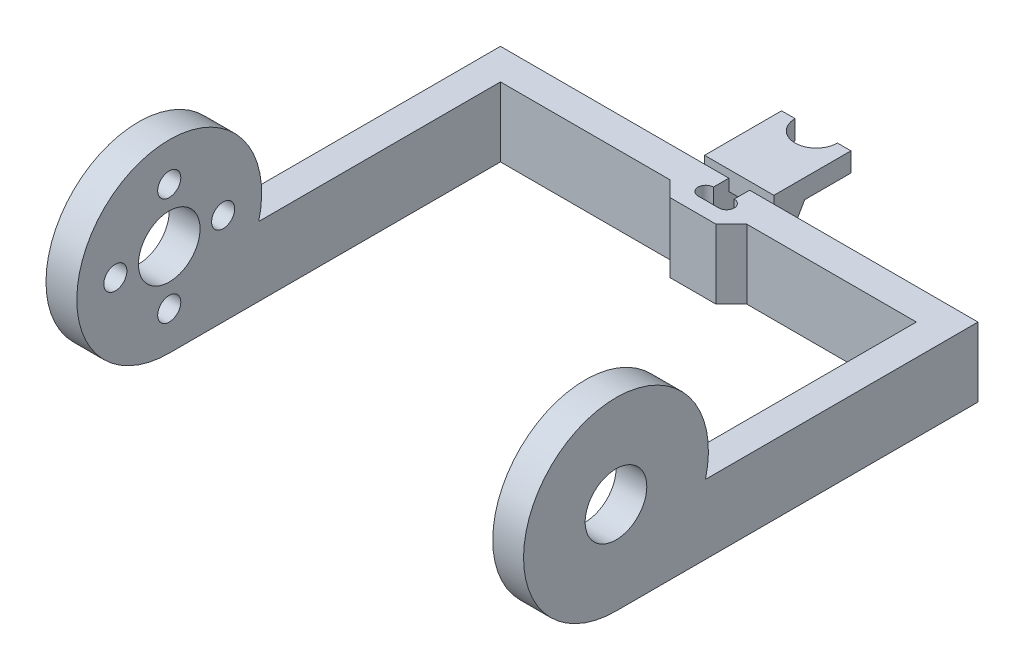
ISO-10303-21;
HEADER;
FILE_DESCRIPTION(('STEP AP214'),'2;1');
FILE_NAME('part.step','',(''),(''),'','','');
FILE_SCHEMA(('AUTOMOTIVE_DESIGN { 1 0 10303 214 1 1 1 1 }'));
ENDSEC;
DATA;
#1=APPLICATION_CONTEXT('core data for automotive mechanical design processes');
#2=APPLICATION_PROTOCOL_DEFINITION('international standard','automotive_design',2000,#1);
#3=PRODUCT_CONTEXT('',#1,'mechanical');
#4=PRODUCT('Part','Part','',(#3));
#5=PRODUCT_RELATED_PRODUCT_CATEGORY('part','',(#4));
#6=PRODUCT_DEFINITION_FORMATION('','',#4);
#7=PRODUCT_DEFINITION_CONTEXT('part definition',#1,'design');
#8=PRODUCT_DEFINITION('design','',#6,#7);
#9=PRODUCT_DEFINITION_SHAPE('','',#8);
#10=(LENGTH_UNIT() NAMED_UNIT(*) SI_UNIT(.MILLI.,.METRE.));
#11=(NAMED_UNIT(*) PLANE_ANGLE_UNIT() SI_UNIT($,.RADIAN.));
#12=(NAMED_UNIT(*) SI_UNIT($,.STERADIAN.) SOLID_ANGLE_UNIT());
#13=UNCERTAINTY_MEASURE_WITH_UNIT(LENGTH_MEASURE(1.E-05),#10,'distance_accuracy_value','');
#14=(GEOMETRIC_REPRESENTATION_CONTEXT(3) GLOBAL_UNCERTAINTY_ASSIGNED_CONTEXT((#13)) GLOBAL_UNIT_ASSIGNED_CONTEXT((#10,
#11,#12)) REPRESENTATION_CONTEXT('',''));
#15=CARTESIAN_POINT('',(0.,0.,0.));
#16=DIRECTION('',(0.,0.,1.));
#17=DIRECTION('',(1.,0.,0.));
#18=AXIS2_PLACEMENT_3D('',#15,#16,#17);
#19=CARTESIAN_POINT('',(-62.,-3.,-47.));
#20=DIRECTION('',(0.,0.,-1.));
#21=DIRECTION('',(-1.,0.,0.));
#22=AXIS2_PLACEMENT_3D('',#19,#20,#21);
#23=PLANE('',#22);
#24=DIRECTION('',(0.,1.,0.));
#25=VECTOR('',#24,1.);
#26=CARTESIAN_POINT('',(-35.5,-4.5,-47.));
#27=LINE('',#26,#25);
#28=CARTESIAN_POINT('',(-35.5,-11.4282032302756,-47.));
#29=VERTEX_POINT('',#28);
#30=CARTESIAN_POINT('',(-35.5,-3.,-47.));
#31=VERTEX_POINT('',#30);
#32=EDGE_CURVE('E310',#29,#31,#27,.T.);
#33=ORIENTED_EDGE('',*,*,#32,.F.);
#34=DIRECTION('',(1.,0.,0.));
#35=VECTOR('',#34,1.);
#36=CARTESIAN_POINT('',(-62.,-11.4282032302756,-47.));
#37=LINE('',#36,#35);
#38=CARTESIAN_POINT('',(-32.35,-11.4282032302756,-47.));
#39=VERTEX_POINT('',#38);
#40=EDGE_CURVE('E431',#29,#39,#37,.T.);
#41=ORIENTED_EDGE('',*,*,#40,.T.);
#42=DIRECTION('',(0.,1.,0.));
#43=VECTOR('',#42,1.);
#44=CARTESIAN_POINT('',(-32.35,-13.,-47.));
#45=LINE('',#44,#43);
#46=CARTESIAN_POINT('',(-32.35,-12.,-47.));
#47=VERTEX_POINT('',#46);
#48=EDGE_CURVE('E265',#47,#39,#45,.T.);
#49=ORIENTED_EDGE('',*,*,#48,.F.);
#50=DIRECTION('',(1.,0.,0.));
#51=VECTOR('',#50,1.);
#52=CARTESIAN_POINT('',(-62.,-12.,-47.));
#53=LINE('',#52,#51);
#54=CARTESIAN_POINT('',(-62.,-12.,-47.));
#55=VERTEX_POINT('',#54);
#56=EDGE_CURVE('E392',#55,#47,#53,.T.);
#57=ORIENTED_EDGE('',*,*,#56,.F.);
#58=DIRECTION('',(0.,1.,0.));
#59=VECTOR('',#58,1.);
#60=CARTESIAN_POINT('',(-62.,-3.,-47.));
#61=LINE('',#60,#59);
#62=CARTESIAN_POINT('',(-62.,-3.,-47.));
#63=VERTEX_POINT('',#62);
#64=EDGE_CURVE('E372',#55,#63,#61,.T.);
#65=ORIENTED_EDGE('',*,*,#64,.T.);
#66=DIRECTION('',(1.,0.,0.));
#67=VECTOR('',#66,1.);
#68=CARTESIAN_POINT('',(-62.,-3.,-47.));
#69=LINE('',#68,#67);
#70=EDGE_CURVE('E386',#63,#31,#69,.T.);
#71=ORIENTED_EDGE('',*,*,#70,.T.);
#72=EDGE_LOOP('',(#33,#41,#49,#57,#65,#71));
#73=FACE_BOUND('',#72,.T.);
#74=ADVANCED_FACE('F35',(#73),#23,.T.);
#75=DIRECTION('',(0.,1.,0.));
#76=VECTOR('',#75,1.);
#77=CARTESIAN_POINT('',(-29.65,-13.,-47.));
#78=LINE('',#77,#76);
#79=CARTESIAN_POINT('',(-29.65,-12.,-47.));
#80=VERTEX_POINT('',#79);
#81=CARTESIAN_POINT('',(-29.65,-11.4282032302756,-47.));
#82=VERTEX_POINT('',#81);
#83=EDGE_CURVE('E268',#80,#82,#78,.T.);
#84=ORIENTED_EDGE('',*,*,#83,.T.);
#85=DIRECTION('',(1.,0.,0.));
#86=VECTOR('',#85,1.);
#87=CARTESIAN_POINT('',(-62.,-11.4282032302756,-47.));
#88=LINE('',#87,#86);
#89=CARTESIAN_POINT('',(-26.5,-11.4282032302756,-47.));
#90=VERTEX_POINT('',#89);
#91=EDGE_CURVE('E442',#82,#90,#88,.T.);
#92=ORIENTED_EDGE('',*,*,#91,.T.);
#93=DIRECTION('',(0.,1.,0.));
#94=VECTOR('',#93,1.);
#95=CARTESIAN_POINT('',(-26.5,-4.5,-47.));
#96=LINE('',#95,#94);
#97=CARTESIAN_POINT('',(-26.5,-3.,-47.));
#98=VERTEX_POINT('',#97);
#99=EDGE_CURVE('E59',#90,#98,#96,.T.);
#100=ORIENTED_EDGE('',*,*,#99,.T.);
#101=CARTESIAN_POINT('',(0.,-3.,-47.));
#102=VERTEX_POINT('',#101);
#103=EDGE_CURVE('E395',#98,#102,#69,.T.);
#104=ORIENTED_EDGE('',*,*,#103,.T.);
#105=DIRECTION('',(0.,1.,0.));
#106=VECTOR('',#105,1.);
#107=CARTESIAN_POINT('',(0.,-3.,-47.));
#108=LINE('',#107,#106);
#109=CARTESIAN_POINT('',(0.,-12.,-47.));
#110=VERTEX_POINT('',#109);
#111=EDGE_CURVE('E366',#110,#102,#108,.T.);
#112=ORIENTED_EDGE('',*,*,#111,.F.);
#113=EDGE_CURVE('E396',#80,#110,#53,.T.);
#114=ORIENTED_EDGE('',*,*,#113,.F.);
#115=EDGE_LOOP('',(#84,#92,#100,#104,#112,#114));
#116=FACE_BOUND('',#115,.T.);
#117=ADVANCED_FACE('F468',(#116),#23,.T.);
#118=CARTESIAN_POINT('',(-62.,-3.,-47.));
#119=DIRECTION('',(0.,1.,0.));
#120=DIRECTION('',(0.,0.,1.));
#121=AXIS2_PLACEMENT_3D('',#118,#119,#120);
#122=PLANE('',#121);
#123=DIRECTION('',(1.,0.,0.));
#124=VECTOR('',#123,1.);
#125=CARTESIAN_POINT('',(-62.,-3.,-43.));
#126=LINE('',#125,#124);
#127=CARTESIAN_POINT('',(-58.,-3.,-43.));
#128=VERTEX_POINT('',#127);
#129=CARTESIAN_POINT('',(-36.,-3.,-43.));
#130=VERTEX_POINT('',#129);
#131=EDGE_CURVE('E354',#128,#130,#126,.T.);
#132=ORIENTED_EDGE('',*,*,#131,.T.);
#133=DIRECTION('',(-0.707106781186548,0.,-0.707106781186548));
#134=VECTOR('',#133,1.);
#135=CARTESIAN_POINT('',(-51.,-3.,-58.));
#136=LINE('',#135,#134);
#137=CARTESIAN_POINT('',(-34.,-3.,-41.));
#138=VERTEX_POINT('',#137);
#139=EDGE_CURVE('E429',#130,#138,#136,.F.);
#140=ORIENTED_EDGE('',*,*,#139,.T.);
#141=DIRECTION('',(1.,0.,0.));
#142=VECTOR('',#141,1.);
#143=CARTESIAN_POINT('',(-62.,-3.,-41.));
#144=LINE('',#143,#142);
#145=CARTESIAN_POINT('',(-28.,-3.,-41.));
#146=VERTEX_POINT('',#145);
#147=EDGE_CURVE('E356',#138,#146,#144,.T.);
#148=ORIENTED_EDGE('',*,*,#147,.T.);
#149=DIRECTION('',(-0.707106781186548,0.,0.707106781186548));
#150=VECTOR('',#149,1.);
#151=CARTESIAN_POINT('',(-42.,-3.,-27.));
#152=LINE('',#151,#150);
#153=CARTESIAN_POINT('',(-26.,-3.,-43.));
#154=VERTEX_POINT('',#153);
#155=EDGE_CURVE('E422',#146,#154,#152,.F.);
#156=ORIENTED_EDGE('',*,*,#155,.T.);
#157=DIRECTION('',(1.,0.,0.));
#158=VECTOR('',#157,1.);
#159=CARTESIAN_POINT('',(-62.,-3.,-43.));
#160=LINE('',#159,#158);
#161=CARTESIAN_POINT('',(-4.,-3.,-43.));
#162=VERTEX_POINT('',#161);
#163=EDGE_CURVE('E358',#154,#162,#160,.T.);
#164=ORIENTED_EDGE('',*,*,#163,.T.);
#165=DIRECTION('',(0.,0.,1.));
#166=VECTOR('',#165,1.);
#167=CARTESIAN_POINT('',(-4.,-3.,-47.));
#168=LINE('',#167,#166);
#169=CARTESIAN_POINT('',(-4.,-3.00000000000001,-11.6189500386223));
#170=VERTEX_POINT('',#169);
#171=EDGE_CURVE('E351',#162,#170,#168,.T.);
#172=ORIENTED_EDGE('',*,*,#171,.T.);
#173=DIRECTION('',(1.,0.,0.));
#174=VECTOR('',#173,1.);
#175=CARTESIAN_POINT('',(-62.,-3.00000000000001,-11.6189500386223));
#176=LINE('',#175,#174);
#177=CARTESIAN_POINT('',(0.,-3.00000000000001,-11.6189500386223));
#178=VERTEX_POINT('',#177);
#179=EDGE_CURVE('E375',#170,#178,#176,.T.);
#180=ORIENTED_EDGE('',*,*,#179,.T.);
#181=DIRECTION('',(0.,0.,1.));
#182=VECTOR('',#181,1.);
#183=CARTESIAN_POINT('',(0.,-3.,-47.));
#184=LINE('',#183,#182);
#185=EDGE_CURVE('E361',#102,#178,#184,.T.);
#186=ORIENTED_EDGE('',*,*,#185,.F.);
#187=ORIENTED_EDGE('',*,*,#103,.F.);
#188=CARTESIAN_POINT('',(-29.65,-3.,-47.));
#189=VERTEX_POINT('',#188);
#190=EDGE_CURVE('E391',#189,#98,#69,.T.);
#191=ORIENTED_EDGE('',*,*,#190,.F.);
#192=DIRECTION('',(0.,0.,-1.));
#193=VECTOR('',#192,1.);
#194=CARTESIAN_POINT('',(-29.65,-3.,-47.));
#195=LINE('',#194,#193);
#196=CARTESIAN_POINT('',(-29.65,-3.,-45.));
#197=VERTEX_POINT('',#196);
#198=EDGE_CURVE('E257',#197,#189,#195,.T.);
#199=ORIENTED_EDGE('',*,*,#198,.F.);
#200=CARTESIAN_POINT('',(-29.65,-3.,-44.));
#201=DIRECTION('',(0.,1.,0.));
#202=DIRECTION('',(0.,0.,-1.));
#203=AXIS2_PLACEMENT_3D('',#200,#201,#202);
#204=CIRCLE('',#203,1.);
#205=CARTESIAN_POINT('',(-29.65,-3.,-43.));
#206=VERTEX_POINT('',#205);
#207=EDGE_CURVE('E255',#206,#197,#204,.T.);
#208=ORIENTED_EDGE('',*,*,#207,.F.);
#209=DIRECTION('',(1.,0.,0.));
#210=VECTOR('',#209,1.);
#211=CARTESIAN_POINT('',(-32.35,-3.,-43.));
#212=LINE('',#211,#210);
#213=CARTESIAN_POINT('',(-32.35,-3.,-43.));
#214=VERTEX_POINT('',#213);
#215=EDGE_CURVE('E232',#214,#206,#212,.T.);
#216=ORIENTED_EDGE('',*,*,#215,.F.);
#217=CARTESIAN_POINT('',(-32.35,-3.,-44.));
#218=DIRECTION('',(0.,1.,0.));
#219=DIRECTION('',(0.,0.,1.));
#220=AXIS2_PLACEMENT_3D('',#217,#218,#219);
#221=CIRCLE('',#220,1.);
#222=CARTESIAN_POINT('',(-32.35,-3.,-45.));
#223=VERTEX_POINT('',#222);
#224=EDGE_CURVE('E242',#223,#214,#221,.T.);
#225=ORIENTED_EDGE('',*,*,#224,.F.);
#226=DIRECTION('',(0.,0.,1.));
#227=VECTOR('',#226,1.);
#228=CARTESIAN_POINT('',(-32.35,-3.,-45.));
#229=LINE('',#228,#227);
#230=CARTESIAN_POINT('',(-32.35,-3.,-47.));
#231=VERTEX_POINT('',#230);
#232=EDGE_CURVE('E239',#231,#223,#229,.T.);
#233=ORIENTED_EDGE('',*,*,#232,.F.);
#234=EDGE_CURVE('E390',#31,#231,#69,.T.);
#235=ORIENTED_EDGE('',*,*,#234,.F.);
#236=ORIENTED_EDGE('',*,*,#70,.F.);
#237=DIRECTION('',(0.,0.,1.));
#238=VECTOR('',#237,1.);
#239=CARTESIAN_POINT('',(-62.,-3.,-47.));
#240=LINE('',#239,#238);
#241=CARTESIAN_POINT('',(-62.,-3.00000000000001,-11.6189500386223));
#242=VERTEX_POINT('',#241);
#243=EDGE_CURVE('E362',#63,#242,#240,.T.);
#244=ORIENTED_EDGE('',*,*,#243,.T.);
#245=CARTESIAN_POINT('',(-58.,-3.00000000000001,-11.6189500386223));
#246=VERTEX_POINT('',#245);
#247=EDGE_CURVE('E401',#242,#246,#176,.T.);
#248=ORIENTED_EDGE('',*,*,#247,.T.);
#249=DIRECTION('',(0.,0.,-1.));
#250=VECTOR('',#249,1.);
#251=CARTESIAN_POINT('',(-58.,-3.,-47.));
#252=LINE('',#251,#250);
#253=EDGE_CURVE('E348',#246,#128,#252,.T.);
#254=ORIENTED_EDGE('',*,*,#253,.T.);
#255=EDGE_LOOP('',(#132,#140,#148,#156,#164,#172,#180,#186,#187,#191,#199,#208,#216,#225,#233,
#235,#236,#244,#248,#254));
#256=FACE_BOUND('',#255,.T.);
#257=ADVANCED_FACE('F252',(#256),#122,.T.);
#258=CARTESIAN_POINT('',(-62.,-12.,-47.));
#259=DIRECTION('',(0.,-1.,0.));
#260=DIRECTION('',(0.,0.,-1.));
#261=AXIS2_PLACEMENT_3D('',#258,#259,#260);
#262=PLANE('',#261);
#263=DIRECTION('',(-1.,0.,0.));
#264=VECTOR('',#263,1.);
#265=CARTESIAN_POINT('',(-36.,-12.,-41.));
#266=LINE('',#265,#264);
#267=CARTESIAN_POINT('',(-28.,-12.,-41.));
#268=VERTEX_POINT('',#267);
#269=CARTESIAN_POINT('',(-34.,-12.,-41.));
#270=VERTEX_POINT('',#269);
#271=EDGE_CURVE('E329',#268,#270,#266,.T.);
#272=ORIENTED_EDGE('',*,*,#271,.T.);
#273=DIRECTION('',(0.707106781186548,0.,0.707106781186548));
#274=VECTOR('',#273,1.);
#275=CARTESIAN_POINT('',(-51.,-12.,-58.));
#276=LINE('',#275,#274);
#277=CARTESIAN_POINT('',(-36.,-12.,-43.));
#278=VERTEX_POINT('',#277);
#279=EDGE_CURVE('E427',#270,#278,#276,.F.);
#280=ORIENTED_EDGE('',*,*,#279,.T.);
#281=DIRECTION('',(-1.,0.,0.));
#282=VECTOR('',#281,1.);
#283=CARTESIAN_POINT('',(-58.,-12.,-43.));
#284=LINE('',#283,#282);
#285=CARTESIAN_POINT('',(-58.,-12.,-43.));
#286=VERTEX_POINT('',#285);
#287=EDGE_CURVE('E332',#278,#286,#284,.T.);
#288=ORIENTED_EDGE('',*,*,#287,.T.);
#289=DIRECTION('',(0.,0.,1.));
#290=VECTOR('',#289,1.);
#291=CARTESIAN_POINT('',(-58.,-12.,12.));
#292=LINE('',#291,#290);
#293=CARTESIAN_POINT('',(-58.,-12.,0.));
#294=VERTEX_POINT('',#293);
#295=EDGE_CURVE('E335',#286,#294,#292,.T.);
#296=ORIENTED_EDGE('',*,*,#295,.T.);
#297=DIRECTION('',(1.,0.,0.));
#298=VECTOR('',#297,1.);
#299=CARTESIAN_POINT('',(-62.,-12.,0.));
#300=LINE('',#299,#298);
#301=CARTESIAN_POINT('',(-62.,-12.,0.));
#302=VERTEX_POINT('',#301);
#303=EDGE_CURVE('E397',#302,#294,#300,.T.);
#304=ORIENTED_EDGE('',*,*,#303,.F.);
#305=DIRECTION('',(0.,0.,-1.));
#306=VECTOR('',#305,1.);
#307=CARTESIAN_POINT('',(-62.,-12.,-47.));
#308=LINE('',#307,#306);
#309=EDGE_CURVE('E369',#302,#55,#308,.T.);
#310=ORIENTED_EDGE('',*,*,#309,.T.);
#311=ORIENTED_EDGE('',*,*,#56,.T.);
#312=DIRECTION('',(0.,0.,-1.));
#313=VECTOR('',#312,1.);
#314=CARTESIAN_POINT('',(-32.35,-12.,-46.9999999999999));
#315=LINE('',#314,#313);
#316=CARTESIAN_POINT('',(-32.35,-12.,-45.));
#317=VERTEX_POINT('',#316);
#318=EDGE_CURVE('E415',#317,#47,#315,.T.);
#319=ORIENTED_EDGE('',*,*,#318,.F.);
#320=CARTESIAN_POINT('',(-32.35,-12.,-44.));
#321=DIRECTION('',(0.,-1.,0.));
#322=DIRECTION('',(0.,0.,-1.));
#323=AXIS2_PLACEMENT_3D('',#320,#321,#322);
#324=CIRCLE('',#323,1.);
#325=CARTESIAN_POINT('',(-32.35,-12.,-43.));
#326=VERTEX_POINT('',#325);
#327=EDGE_CURVE('E413',#326,#317,#324,.T.);
#328=ORIENTED_EDGE('',*,*,#327,.F.);
#329=DIRECTION('',(-1.,0.,0.));
#330=VECTOR('',#329,1.);
#331=CARTESIAN_POINT('',(-62.,-12.,-43.));
#332=LINE('',#331,#330);
#333=CARTESIAN_POINT('',(-29.65,-12.,-43.));
#334=VERTEX_POINT('',#333);
#335=EDGE_CURVE('E235',#334,#326,#332,.T.);
#336=ORIENTED_EDGE('',*,*,#335,.F.);
#337=CARTESIAN_POINT('',(-29.65,-12.,-44.));
#338=DIRECTION('',(0.,-1.,0.));
#339=DIRECTION('',(0.,0.,-1.));
#340=AXIS2_PLACEMENT_3D('',#337,#338,#339);
#341=CIRCLE('',#340,1.);
#342=CARTESIAN_POINT('',(-29.65,-12.,-45.));
#343=VERTEX_POINT('',#342);
#344=EDGE_CURVE('E409',#343,#334,#341,.T.);
#345=ORIENTED_EDGE('',*,*,#344,.F.);
#346=DIRECTION('',(0.,0.,1.));
#347=VECTOR('',#346,1.);
#348=CARTESIAN_POINT('',(-29.65,-12.,-47.));
#349=LINE('',#348,#347);
#350=EDGE_CURVE('E411',#80,#343,#349,.T.);
#351=ORIENTED_EDGE('',*,*,#350,.F.);
#352=ORIENTED_EDGE('',*,*,#113,.T.);
#353=DIRECTION('',(0.,0.,-1.));
#354=VECTOR('',#353,1.);
#355=CARTESIAN_POINT('',(0.,-12.,-47.));
#356=LINE('',#355,#354);
#357=CARTESIAN_POINT('',(0.,-12.,0.));
#358=VERTEX_POINT('',#357);
#359=EDGE_CURVE('E381',#358,#110,#356,.T.);
#360=ORIENTED_EDGE('',*,*,#359,.F.);
#361=CARTESIAN_POINT('',(-4.,-12.,0.));
#362=VERTEX_POINT('',#361);
#363=EDGE_CURVE('E400',#362,#358,#300,.T.);
#364=ORIENTED_EDGE('',*,*,#363,.F.);
#365=DIRECTION('',(0.,0.,-1.));
#366=VECTOR('',#365,1.);
#367=CARTESIAN_POINT('',(-4.,-12.,-43.));
#368=LINE('',#367,#366);
#369=CARTESIAN_POINT('',(-4.,-12.,-43.));
#370=VERTEX_POINT('',#369);
#371=EDGE_CURVE('E313',#362,#370,#368,.T.);
#372=ORIENTED_EDGE('',*,*,#371,.T.);
#373=DIRECTION('',(-1.,0.,0.));
#374=VECTOR('',#373,1.);
#375=CARTESIAN_POINT('',(-26.,-12.,-43.));
#376=LINE('',#375,#374);
#377=CARTESIAN_POINT('',(-26.,-12.,-43.));
#378=VERTEX_POINT('',#377);
#379=EDGE_CURVE('E326',#370,#378,#376,.T.);
#380=ORIENTED_EDGE('',*,*,#379,.T.);
#381=DIRECTION('',(0.707106781186548,0.,-0.707106781186548));
#382=VECTOR('',#381,1.);
#383=CARTESIAN_POINT('',(-42.,-12.,-27.));
#384=LINE('',#383,#382);
#385=EDGE_CURVE('E417',#378,#268,#384,.F.);
#386=ORIENTED_EDGE('',*,*,#385,.T.);
#387=EDGE_LOOP('',(#272,#280,#288,#296,#304,#310,#311,#319,#328,#336,#345,#351,#352,#360,#364,
#372,#380,#386));
#388=FACE_BOUND('',#387,.T.);
#389=ADVANCED_FACE('F472',(#388),#262,.T.);
#390=CARTESIAN_POINT('',(-62.,0.,0.));
#391=DIRECTION('',(1.,0.,0.));
#392=DIRECTION('',(0.,0.,-1.));
#393=AXIS2_PLACEMENT_3D('',#390,#391,#392);
#394=CYLINDRICAL_SURFACE('',#393,12.);
#395=ORIENTED_EDGE('',*,*,#179,.F.);
#396=CARTESIAN_POINT('',(-4.,0.,0.));
#397=DIRECTION('',(-1.,0.,0.));
#398=DIRECTION('',(0.,0.,1.));
#399=AXIS2_PLACEMENT_3D('',#396,#397,#398);
#400=CIRCLE('',#399,12.);
#401=EDGE_CURVE('E406',#170,#362,#400,.F.);
#402=ORIENTED_EDGE('',*,*,#401,.T.);
#403=ORIENTED_EDGE('',*,*,#363,.T.);
#404=CARTESIAN_POINT('',(0.,0.,0.));
#405=DIRECTION('',(1.,0.,0.));
#406=DIRECTION('',(0.,0.,-1.));
#407=AXIS2_PLACEMENT_3D('',#404,#405,#406);
#408=CIRCLE('',#407,12.);
#409=EDGE_CURVE('E378',#178,#358,#408,.T.);
#410=ORIENTED_EDGE('',*,*,#409,.F.);
#411=EDGE_LOOP('',(#395,#402,#403,#410));
#412=FACE_BOUND('',#411,.T.);
#413=ADVANCED_FACE('F481',(#412),#394,.T.);
#414=ORIENTED_EDGE('',*,*,#303,.T.);
#415=CARTESIAN_POINT('',(-58.,0.,0.));
#416=DIRECTION('',(1.,0.,0.));
#417=DIRECTION('',(0.,0.,-1.));
#418=AXIS2_PLACEMENT_3D('',#415,#416,#417);
#419=CIRCLE('',#418,12.);
#420=EDGE_CURVE('E389',#294,#246,#419,.F.);
#421=ORIENTED_EDGE('',*,*,#420,.T.);
#422=ORIENTED_EDGE('',*,*,#247,.F.);
#423=CARTESIAN_POINT('',(-62.,0.,0.));
#424=DIRECTION('',(1.,0.,0.));
#425=DIRECTION('',(0.,0.,-1.));
#426=AXIS2_PLACEMENT_3D('',#423,#424,#425);
#427=CIRCLE('',#426,12.);
#428=EDGE_CURVE('E365',#242,#302,#427,.T.);
#429=ORIENTED_EDGE('',*,*,#428,.T.);
#430=EDGE_LOOP('',(#414,#421,#422,#429));
#431=FACE_BOUND('',#430,.T.);
#432=ADVANCED_FACE('F512',(#431),#394,.T.);
#433=CARTESIAN_POINT('',(-62.,0.,0.));
#434=DIRECTION('',(1.,0.,0.));
#435=DIRECTION('',(0.,0.,-1.));
#436=AXIS2_PLACEMENT_3D('',#433,#434,#435);
#437=PLANE('',#436);
#438=CARTESIAN_POINT('',(-62.,-1.98951966012828E-13,-6.9999999999998));
#439=DIRECTION('',(-1.,0.,0.));
#440=DIRECTION('',(0.,0.,1.));
#441=AXIS2_PLACEMENT_3D('',#438,#439,#440);
#442=CIRCLE('',#441,1.50000000000032);
#443=CARTESIAN_POINT('',(-62.,-1.98951966012828E-13,-5.49999999999948));
#444=VERTEX_POINT('',#443);
#445=EDGE_CURVE('E645',#444,#444,#442,.T.);
#446=ORIENTED_EDGE('',*,*,#445,.F.);
#447=EDGE_LOOP('',(#446));
#448=FACE_BOUND('',#447,.T.);
#449=CARTESIAN_POINT('',(-62.,-7.,3.9618942650685E-13));
#450=DIRECTION('',(-1.,0.,0.));
#451=DIRECTION('',(0.,0.,1.));
#452=AXIS2_PLACEMENT_3D('',#449,#450,#451);
#453=CIRCLE('',#452,1.50000000000043);
#454=CARTESIAN_POINT('',(-62.,-7.,1.50000000000082));
#455=VERTEX_POINT('',#454);
#456=EDGE_CURVE('E649',#455,#455,#453,.T.);
#457=ORIENTED_EDGE('',*,*,#456,.F.);
#458=EDGE_LOOP('',(#457));
#459=FACE_BOUND('',#458,.T.);
#460=CARTESIAN_POINT('',(-62.,1.98094713253425E-13,7.0000000000002));
#461=DIRECTION('',(-1.,0.,0.));
#462=DIRECTION('',(0.,0.,1.));
#463=AXIS2_PLACEMENT_3D('',#460,#461,#462);
#464=CIRCLE('',#463,1.50000000000015);
#465=CARTESIAN_POINT('',(-62.,1.98094713253425E-13,8.50000000000035));
#466=VERTEX_POINT('',#465);
#467=EDGE_CURVE('E653',#466,#466,#464,.T.);
#468=ORIENTED_EDGE('',*,*,#467,.F.);
#469=EDGE_LOOP('',(#468));
#470=FACE_BOUND('',#469,.T.);
#471=CARTESIAN_POINT('',(-62.,7.,0.));
#472=DIRECTION('',(-1.,0.,0.));
#473=DIRECTION('',(0.,0.,1.));
#474=AXIS2_PLACEMENT_3D('',#471,#472,#473);
#475=CIRCLE('',#474,1.5);
#476=CARTESIAN_POINT('',(-62.,7.,1.5));
#477=VERTEX_POINT('',#476);
#478=EDGE_CURVE('E657',#477,#477,#475,.T.);
#479=ORIENTED_EDGE('',*,*,#478,.F.);
#480=EDGE_LOOP('',(#479));
#481=FACE_BOUND('',#480,.T.);
#482=CARTESIAN_POINT('',(-62.,0.,0.));
#483=DIRECTION('',(1.,0.,0.));
#484=DIRECTION('',(0.,0.,-1.));
#485=AXIS2_PLACEMENT_3D('',#482,#483,#484);
#486=CIRCLE('',#485,4.);
#487=CARTESIAN_POINT('',(-62.,0.,-4.));
#488=VERTEX_POINT('',#487);
#489=EDGE_CURVE('E249',#488,#488,#486,.T.);
#490=ORIENTED_EDGE('',*,*,#489,.T.);
#491=EDGE_LOOP('',(#490));
#492=FACE_BOUND('',#491,.T.);
#493=ORIENTED_EDGE('',*,*,#243,.F.);
#494=ORIENTED_EDGE('',*,*,#64,.F.);
#495=ORIENTED_EDGE('',*,*,#309,.F.);
#496=ORIENTED_EDGE('',*,*,#428,.F.);
#497=EDGE_LOOP('',(#493,#494,#495,#496));
#498=FACE_BOUND('',#497,.T.);
#499=ADVANCED_FACE('F516',(#448,#459,#470,#481,#492,#498),#437,.F.);
#500=CARTESIAN_POINT('',(0.,0.,0.));
#501=DIRECTION('',(1.,0.,0.));
#502=DIRECTION('',(0.,0.,-1.));
#503=AXIS2_PLACEMENT_3D('',#500,#501,#502);
#504=PLANE('',#503);
#505=CARTESIAN_POINT('',(0.,0.,0.));
#506=DIRECTION('',(1.,0.,0.));
#507=DIRECTION('',(0.,0.,-1.));
#508=AXIS2_PLACEMENT_3D('',#505,#506,#507);
#509=CIRCLE('',#508,4.);
#510=CARTESIAN_POINT('',(0.,0.,-4.));
#511=VERTEX_POINT('',#510);
#512=EDGE_CURVE('E664',#511,#511,#509,.T.);
#513=ORIENTED_EDGE('',*,*,#512,.F.);
#514=EDGE_LOOP('',(#513));
#515=FACE_BOUND('',#514,.T.);
#516=ORIENTED_EDGE('',*,*,#185,.T.);
#517=ORIENTED_EDGE('',*,*,#409,.T.);
#518=ORIENTED_EDGE('',*,*,#359,.T.);
#519=ORIENTED_EDGE('',*,*,#111,.T.);
#520=EDGE_LOOP('',(#516,#517,#518,#519));
#521=FACE_BOUND('',#520,.T.);
#522=ADVANCED_FACE('F476',(#515,#521),#504,.T.);
#523=CARTESIAN_POINT('',(-4.,12.,-43.));
#524=DIRECTION('',(-1.,0.,0.));
#525=DIRECTION('',(0.,0.,1.));
#526=AXIS2_PLACEMENT_3D('',#523,#524,#525);
#527=PLANE('',#526);
#528=CARTESIAN_POINT('',(-4.,0.,0.));
#529=DIRECTION('',(-1.,0.,0.));
#530=DIRECTION('',(0.,0.,1.));
#531=AXIS2_PLACEMENT_3D('',#528,#529,#530);
#532=CIRCLE('',#531,4.);
#533=CARTESIAN_POINT('',(-4.,0.,4.));
#534=VERTEX_POINT('',#533);
#535=EDGE_CURVE('E660',#534,#534,#532,.T.);
#536=ORIENTED_EDGE('',*,*,#535,.F.);
#537=EDGE_LOOP('',(#536));
#538=FACE_BOUND('',#537,.T.);
#539=DIRECTION('',(0.,-1.,0.));
#540=VECTOR('',#539,1.);
#541=CARTESIAN_POINT('',(-4.,12.,-43.));
#542=LINE('',#541,#540);
#543=EDGE_CURVE('E346',#162,#370,#542,.T.);
#544=ORIENTED_EDGE('',*,*,#543,.T.);
#545=ORIENTED_EDGE('',*,*,#371,.F.);
#546=ORIENTED_EDGE('',*,*,#401,.F.);
#547=ORIENTED_EDGE('',*,*,#171,.F.);
#548=EDGE_LOOP('',(#544,#545,#546,#547));
#549=FACE_BOUND('',#548,.T.);
#550=ADVANCED_FACE('F485',(#538,#549),#527,.T.);
#551=CARTESIAN_POINT('',(-26.,12.,-43.));
#552=DIRECTION('',(0.,0.,1.));
#553=DIRECTION('',(1.,0.,0.));
#554=AXIS2_PLACEMENT_3D('',#551,#552,#553);
#555=PLANE('',#554);
#556=DIRECTION('',(0.,-1.,0.));
#557=VECTOR('',#556,1.);
#558=CARTESIAN_POINT('',(-26.,12.,-43.));
#559=LINE('',#558,#557);
#560=EDGE_CURVE('E343',#154,#378,#559,.T.);
#561=ORIENTED_EDGE('',*,*,#560,.T.);
#562=ORIENTED_EDGE('',*,*,#379,.F.);
#563=ORIENTED_EDGE('',*,*,#543,.F.);
#564=ORIENTED_EDGE('',*,*,#163,.F.);
#565=EDGE_LOOP('',(#561,#562,#563,#564));
#566=FACE_BOUND('',#565,.T.);
#567=ADVANCED_FACE('F489',(#566),#555,.T.);
#568=CARTESIAN_POINT('',(-36.,12.,-41.));
#569=DIRECTION('',(0.,0.,1.));
#570=DIRECTION('',(1.,0.,0.));
#571=AXIS2_PLACEMENT_3D('',#568,#569,#570);
#572=PLANE('',#571);
#573=ORIENTED_EDGE('',*,*,#147,.F.);
#574=DIRECTION('',(0.,-1.,0.));
#575=VECTOR('',#574,1.);
#576=CARTESIAN_POINT('',(-34.,12.,-41.));
#577=LINE('',#576,#575);
#578=EDGE_CURVE('E424',#138,#270,#577,.T.);
#579=ORIENTED_EDGE('',*,*,#578,.T.);
#580=ORIENTED_EDGE('',*,*,#271,.F.);
#581=DIRECTION('',(0.,1.,0.));
#582=VECTOR('',#581,1.);
#583=CARTESIAN_POINT('',(-28.,12.,-41.));
#584=LINE('',#583,#582);
#585=EDGE_CURVE('E419',#268,#146,#584,.T.);
#586=ORIENTED_EDGE('',*,*,#585,.T.);
#587=EDGE_LOOP('',(#573,#579,#580,#586));
#588=FACE_BOUND('',#587,.T.);
#589=ADVANCED_FACE('F498',(#588),#572,.T.);
#590=CARTESIAN_POINT('',(-58.,12.,-43.));
#591=DIRECTION('',(0.,0.,1.));
#592=DIRECTION('',(1.,0.,0.));
#593=AXIS2_PLACEMENT_3D('',#590,#591,#592);
#594=PLANE('',#593);
#595=DIRECTION('',(0.,-1.,0.));
#596=VECTOR('',#595,1.);
#597=CARTESIAN_POINT('',(-58.,12.,-43.));
#598=LINE('',#597,#596);
#599=EDGE_CURVE('E338',#128,#286,#598,.T.);
#600=ORIENTED_EDGE('',*,*,#599,.T.);
#601=ORIENTED_EDGE('',*,*,#287,.F.);
#602=DIRECTION('',(0.,-1.,0.));
#603=VECTOR('',#602,1.);
#604=CARTESIAN_POINT('',(-36.,12.,-43.));
#605=LINE('',#604,#603);
#606=EDGE_CURVE('E340',#130,#278,#605,.T.);
#607=ORIENTED_EDGE('',*,*,#606,.F.);
#608=ORIENTED_EDGE('',*,*,#131,.F.);
#609=EDGE_LOOP('',(#600,#601,#607,#608));
#610=FACE_BOUND('',#609,.T.);
#611=ADVANCED_FACE('F505',(#610),#594,.T.);
#612=CARTESIAN_POINT('',(-58.,12.,12.));
#613=DIRECTION('',(1.,0.,0.));
#614=DIRECTION('',(0.,0.,-1.));
#615=AXIS2_PLACEMENT_3D('',#612,#613,#614);
#616=PLANE('',#615);
#617=CARTESIAN_POINT('',(-58.,-1.98951966012828E-13,-6.9999999999998));
#618=DIRECTION('',(1.,0.,0.));
#619=DIRECTION('',(0.,0.,-1.));
#620=AXIS2_PLACEMENT_3D('',#617,#618,#619);
#621=CIRCLE('',#620,1.50000000000032);
#622=CARTESIAN_POINT('',(-58.,-1.98951966012828E-13,-8.50000000000012));
#623=VERTEX_POINT('',#622);
#624=EDGE_CURVE('E679',#623,#623,#621,.F.);
#625=ORIENTED_EDGE('',*,*,#624,.T.);
#626=EDGE_LOOP('',(#625));
#627=FACE_BOUND('',#626,.T.);
#628=CARTESIAN_POINT('',(-58.,-7.,3.9618942650685E-13));
#629=DIRECTION('',(1.,0.,0.));
#630=DIRECTION('',(0.,0.,-1.));
#631=AXIS2_PLACEMENT_3D('',#628,#629,#630);
#632=CIRCLE('',#631,1.50000000000043);
#633=CARTESIAN_POINT('',(-58.,-7.,-1.50000000000003));
#634=VERTEX_POINT('',#633);
#635=EDGE_CURVE('E675',#634,#634,#632,.F.);
#636=ORIENTED_EDGE('',*,*,#635,.T.);
#637=EDGE_LOOP('',(#636));
#638=FACE_BOUND('',#637,.T.);
#639=CARTESIAN_POINT('',(-58.,1.98094713253425E-13,7.0000000000002));
#640=DIRECTION('',(1.,0.,0.));
#641=DIRECTION('',(0.,0.,-1.));
#642=AXIS2_PLACEMENT_3D('',#639,#640,#641);
#643=CIRCLE('',#642,1.50000000000015);
#644=CARTESIAN_POINT('',(-58.,1.98094713253425E-13,5.50000000000004));
#645=VERTEX_POINT('',#644);
#646=EDGE_CURVE('E671',#645,#645,#643,.F.);
#647=ORIENTED_EDGE('',*,*,#646,.T.);
#648=EDGE_LOOP('',(#647));
#649=FACE_BOUND('',#648,.T.);
#650=CARTESIAN_POINT('',(-58.,7.,0.));
#651=DIRECTION('',(1.,0.,0.));
#652=DIRECTION('',(0.,0.,-1.));
#653=AXIS2_PLACEMENT_3D('',#650,#651,#652);
#654=CIRCLE('',#653,1.5);
#655=CARTESIAN_POINT('',(-58.,7.,-1.5));
#656=VERTEX_POINT('',#655);
#657=EDGE_CURVE('E667',#656,#656,#654,.F.);
#658=ORIENTED_EDGE('',*,*,#657,.T.);
#659=EDGE_LOOP('',(#658));
#660=FACE_BOUND('',#659,.T.);
#661=CARTESIAN_POINT('',(-58.,0.,0.));
#662=DIRECTION('',(1.,0.,0.));
#663=DIRECTION('',(0.,0.,-1.));
#664=AXIS2_PLACEMENT_3D('',#661,#662,#663);
#665=CIRCLE('',#664,4.);
#666=CARTESIAN_POINT('',(-58.,0.,-4.));
#667=VERTEX_POINT('',#666);
#668=EDGE_CURVE('E39',#667,#667,#665,.T.);
#669=ORIENTED_EDGE('',*,*,#668,.F.);
#670=EDGE_LOOP('',(#669));
#671=FACE_BOUND('',#670,.T.);
#672=ORIENTED_EDGE('',*,*,#420,.F.);
#673=ORIENTED_EDGE('',*,*,#295,.F.);
#674=ORIENTED_EDGE('',*,*,#599,.F.);
#675=ORIENTED_EDGE('',*,*,#253,.F.);
#676=EDGE_LOOP('',(#672,#673,#674,#675));
#677=FACE_BOUND('',#676,.T.);
#678=ADVANCED_FACE('F509',(#627,#638,#649,#660,#671,#677),#616,.T.);
#679=CARTESIAN_POINT('',(-35.5,-4.5,-47.));
#680=DIRECTION('',(0.,0.,1.));
#681=DIRECTION('',(0.,-1.,0.));
#682=AXIS2_PLACEMENT_3D('',#679,#680,#681);
#683=PLANE('',#682);
#684=CARTESIAN_POINT('',(-35.5,-2.,-47.));
#685=VERTEX_POINT('',#684);
#686=EDGE_CURVE('E314',#31,#685,#27,.T.);
#687=ORIENTED_EDGE('',*,*,#686,.F.);
#688=ORIENTED_EDGE('',*,*,#234,.T.);
#689=CARTESIAN_POINT('',(-32.35,-4.5,-47.));
#690=VERTEX_POINT('',#689);
#691=EDGE_CURVE('E266',#690,#231,#45,.T.);
#692=ORIENTED_EDGE('',*,*,#691,.F.);
#693=DIRECTION('',(1.,0.,0.));
#694=VECTOR('',#693,1.);
#695=CARTESIAN_POINT('',(-35.5,-4.5,-47.));
#696=LINE('',#695,#694);
#697=CARTESIAN_POINT('',(-29.65,-4.5,-47.));
#698=VERTEX_POINT('',#697);
#699=EDGE_CURVE('E292',#690,#698,#696,.T.);
#700=ORIENTED_EDGE('',*,*,#699,.T.);
#701=EDGE_CURVE('E269',#698,#189,#78,.T.);
#702=ORIENTED_EDGE('',*,*,#701,.T.);
#703=ORIENTED_EDGE('',*,*,#190,.T.);
#704=CARTESIAN_POINT('',(-26.5,-2.,-47.));
#705=VERTEX_POINT('',#704);
#706=EDGE_CURVE('E309',#98,#705,#96,.T.);
#707=ORIENTED_EDGE('',*,*,#706,.T.);
#708=DIRECTION('',(1.,0.,0.));
#709=VECTOR('',#708,1.);
#710=CARTESIAN_POINT('',(-35.5,-2.,-47.));
#711=LINE('',#710,#709);
#712=EDGE_CURVE('E264',#685,#705,#711,.T.);
#713=ORIENTED_EDGE('',*,*,#712,.F.);
#714=EDGE_LOOP('',(#687,#688,#692,#700,#702,#703,#707,#713));
#715=FACE_BOUND('',#714,.T.);
#716=ADVANCED_FACE('F527',(#715),#683,.T.);
#717=CARTESIAN_POINT('',(-35.5,-4.5,-57.));
#718=DIRECTION('',(-1.,0.,0.));
#719=DIRECTION('',(0.,0.,1.));
#720=AXIS2_PLACEMENT_3D('',#717,#718,#719);
#721=PLANE('',#720);
#722=ORIENTED_EDGE('',*,*,#32,.T.);
#723=ORIENTED_EDGE('',*,*,#686,.T.);
#724=DIRECTION('',(0.,0.,1.));
#725=VECTOR('',#724,1.);
#726=CARTESIAN_POINT('',(-35.5,-2.,-57.));
#727=LINE('',#726,#725);
#728=CARTESIAN_POINT('',(-35.5,-2.,-57.));
#729=VERTEX_POINT('',#728);
#730=EDGE_CURVE('E289',#729,#685,#727,.T.);
#731=ORIENTED_EDGE('',*,*,#730,.F.);
#732=DIRECTION('',(0.,1.,0.));
#733=VECTOR('',#732,1.);
#734=CARTESIAN_POINT('',(-35.5,-4.5,-57.));
#735=LINE('',#734,#733);
#736=CARTESIAN_POINT('',(-35.5,-4.5,-57.));
#737=VERTEX_POINT('',#736);
#738=EDGE_CURVE('E315',#737,#729,#735,.T.);
#739=ORIENTED_EDGE('',*,*,#738,.F.);
#740=DIRECTION('',(0.,0.,1.));
#741=VECTOR('',#740,1.);
#742=CARTESIAN_POINT('',(-35.5,-4.5,-57.));
#743=LINE('',#742,#741);
#744=CARTESIAN_POINT('',(-35.5,-4.5,-51.));
#745=VERTEX_POINT('',#744);
#746=EDGE_CURVE('E306',#737,#745,#743,.T.);
#747=ORIENTED_EDGE('',*,*,#746,.T.);
#748=DIRECTION('',(0.,-0.866025403784442,0.499999999999995));
#749=VECTOR('',#748,1.);
#750=CARTESIAN_POINT('',(-35.5,-11.4282032302756,-47.));
#751=LINE('',#750,#749);
#752=EDGE_CURVE('E447',#745,#29,#751,.T.);
#753=ORIENTED_EDGE('',*,*,#752,.T.);
#754=EDGE_LOOP('',(#722,#723,#731,#739,#747,#753));
#755=FACE_BOUND('',#754,.T.);
#756=ADVANCED_FACE('F538',(#755),#721,.T.);
#757=CARTESIAN_POINT('',(-35.5,-4.5,-57.));
#758=DIRECTION('',(0.,0.,-1.));
#759=DIRECTION('',(0.,1.,0.));
#760=AXIS2_PLACEMENT_3D('',#757,#758,#759);
#761=PLANE('',#760);
#762=ORIENTED_EDGE('',*,*,#738,.T.);
#763=DIRECTION('',(-1.,0.,0.));
#764=VECTOR('',#763,1.);
#765=CARTESIAN_POINT('',(-35.5,-2.,-57.));
#766=LINE('',#765,#764);
#767=CARTESIAN_POINT('',(-33.75,-2.,-57.));
#768=VERTEX_POINT('',#767);
#769=EDGE_CURVE('E286',#768,#729,#766,.T.);
#770=ORIENTED_EDGE('',*,*,#769,.F.);
#771=DIRECTION('',(0.,1.,0.));
#772=VECTOR('',#771,1.);
#773=CARTESIAN_POINT('',(-33.75,-4.5,-57.));
#774=LINE('',#773,#772);
#775=CARTESIAN_POINT('',(-33.75,-4.5,-57.));
#776=VERTEX_POINT('',#775);
#777=EDGE_CURVE('E317',#776,#768,#774,.T.);
#778=ORIENTED_EDGE('',*,*,#777,.F.);
#779=DIRECTION('',(-1.,0.,0.));
#780=VECTOR('',#779,1.);
#781=CARTESIAN_POINT('',(-35.5,-4.5,-57.));
#782=LINE('',#781,#780);
#783=EDGE_CURVE('E303',#776,#737,#782,.T.);
#784=ORIENTED_EDGE('',*,*,#783,.T.);
#785=EDGE_LOOP('',(#762,#770,#778,#784));
#786=FACE_BOUND('',#785,.T.);
#787=ADVANCED_FACE('F608',(#786),#761,.T.);
#788=CARTESIAN_POINT('',(-31.,-4.5,-57.));
#789=DIRECTION('',(0.,1.,0.));
#790=DIRECTION('',(0.,0.,1.));
#791=AXIS2_PLACEMENT_3D('',#788,#789,#790);
#792=CYLINDRICAL_SURFACE('',#791,2.75);
#793=ORIENTED_EDGE('',*,*,#777,.T.);
#794=CARTESIAN_POINT('',(-31.,-2.,-57.));
#795=DIRECTION('',(0.,-1.,0.));
#796=DIRECTION('',(0.,0.,1.));
#797=AXIS2_PLACEMENT_3D('',#794,#795,#796);
#798=CIRCLE('',#797,2.75);
#799=CARTESIAN_POINT('',(-28.25,-2.,-57.));
#800=VERTEX_POINT('',#799);
#801=EDGE_CURVE('E283',#800,#768,#798,.T.);
#802=ORIENTED_EDGE('',*,*,#801,.F.);
#803=DIRECTION('',(0.,1.,0.));
#804=VECTOR('',#803,1.);
#805=CARTESIAN_POINT('',(-28.25,-4.5,-57.));
#806=LINE('',#805,#804);
#807=CARTESIAN_POINT('',(-28.25,-4.5,-57.));
#808=VERTEX_POINT('',#807);
#809=EDGE_CURVE('E319',#808,#800,#806,.T.);
#810=ORIENTED_EDGE('',*,*,#809,.F.);
#811=CARTESIAN_POINT('',(-31.,-4.5,-57.));
#812=DIRECTION('',(0.,-1.,0.));
#813=DIRECTION('',(0.,0.,1.));
#814=AXIS2_PLACEMENT_3D('',#811,#812,#813);
#815=CIRCLE('',#814,2.75);
#816=EDGE_CURVE('E300',#808,#776,#815,.T.);
#817=ORIENTED_EDGE('',*,*,#816,.T.);
#818=EDGE_LOOP('',(#793,#802,#810,#817));
#819=FACE_BOUND('',#818,.T.);
#820=ADVANCED_FACE('F611',(#819),#792,.F.);
#821=CARTESIAN_POINT('',(-28.25,-4.5,-57.));
#822=DIRECTION('',(0.,0.,-1.));
#823=DIRECTION('',(0.,1.,0.));
#824=AXIS2_PLACEMENT_3D('',#821,#822,#823);
#825=PLANE('',#824);
#826=ORIENTED_EDGE('',*,*,#809,.T.);
#827=DIRECTION('',(-1.,0.,0.));
#828=VECTOR('',#827,1.);
#829=CARTESIAN_POINT('',(-28.25,-2.,-57.));
#830=LINE('',#829,#828);
#831=CARTESIAN_POINT('',(-26.5,-2.,-57.));
#832=VERTEX_POINT('',#831);
#833=EDGE_CURVE('E280',#832,#800,#830,.T.);
#834=ORIENTED_EDGE('',*,*,#833,.F.);
#835=DIRECTION('',(0.,1.,0.));
#836=VECTOR('',#835,1.);
#837=CARTESIAN_POINT('',(-26.5,-4.5,-57.));
#838=LINE('',#837,#836);
#839=CARTESIAN_POINT('',(-26.5,-4.5,-57.));
#840=VERTEX_POINT('',#839);
#841=EDGE_CURVE('E321',#840,#832,#838,.T.);
#842=ORIENTED_EDGE('',*,*,#841,.F.);
#843=DIRECTION('',(-1.,0.,0.));
#844=VECTOR('',#843,1.);
#845=CARTESIAN_POINT('',(-28.25,-4.5,-57.));
#846=LINE('',#845,#844);
#847=EDGE_CURVE('E297',#840,#808,#846,.T.);
#848=ORIENTED_EDGE('',*,*,#847,.T.);
#849=EDGE_LOOP('',(#826,#834,#842,#848));
#850=FACE_BOUND('',#849,.T.);
#851=ADVANCED_FACE('F615',(#850),#825,.T.);
#852=CARTESIAN_POINT('',(-26.5,-4.5,-47.));
#853=DIRECTION('',(1.,0.,0.));
#854=DIRECTION('',(0.,0.,-1.));
#855=AXIS2_PLACEMENT_3D('',#852,#853,#854);
#856=PLANE('',#855);
#857=ORIENTED_EDGE('',*,*,#841,.T.);
#858=DIRECTION('',(0.,0.,-1.));
#859=VECTOR('',#858,1.);
#860=CARTESIAN_POINT('',(-26.5,-2.,-47.));
#861=LINE('',#860,#859);
#862=EDGE_CURVE('E277',#705,#832,#861,.T.);
#863=ORIENTED_EDGE('',*,*,#862,.F.);
#864=ORIENTED_EDGE('',*,*,#706,.F.);
#865=ORIENTED_EDGE('',*,*,#99,.F.);
#866=DIRECTION('',(0.,0.866025403784442,-0.499999999999995));
#867=VECTOR('',#866,1.);
#868=CARTESIAN_POINT('',(-26.5,-11.4282032302756,-47.));
#869=LINE('',#868,#867);
#870=CARTESIAN_POINT('',(-26.5,-4.5,-51.));
#871=VERTEX_POINT('',#870);
#872=EDGE_CURVE('E44',#90,#871,#869,.T.);
#873=ORIENTED_EDGE('',*,*,#872,.T.);
#874=DIRECTION('',(0.,0.,-1.));
#875=VECTOR('',#874,1.);
#876=CARTESIAN_POINT('',(-26.5,-4.5,-47.));
#877=LINE('',#876,#875);
#878=EDGE_CURVE('E295',#871,#840,#877,.T.);
#879=ORIENTED_EDGE('',*,*,#878,.T.);
#880=EDGE_LOOP('',(#857,#863,#864,#865,#873,#879));
#881=FACE_BOUND('',#880,.T.);
#882=ADVANCED_FACE('F451',(#881),#856,.T.);
#883=CARTESIAN_POINT('',(-31.,-4.5,-57.));
#884=DIRECTION('',(0.,1.,0.));
#885=DIRECTION('',(0.,0.,1.));
#886=AXIS2_PLACEMENT_3D('',#883,#884,#885);
#887=PLANE('',#886);
#888=ORIENTED_EDGE('',*,*,#699,.F.);
#889=DIRECTION('',(0.,0.,-1.));
#890=VECTOR('',#889,1.);
#891=CARTESIAN_POINT('',(-32.35,-4.5,-45.));
#892=LINE('',#891,#890);
#893=CARTESIAN_POINT('',(-32.35,-4.5,-51.));
#894=VERTEX_POINT('',#893);
#895=EDGE_CURVE('E51',#690,#894,#892,.T.);
#896=ORIENTED_EDGE('',*,*,#895,.T.);
#897=DIRECTION('',(-1.,0.,0.));
#898=VECTOR('',#897,1.);
#899=CARTESIAN_POINT('',(-31.,-4.5,-51.));
#900=LINE('',#899,#898);
#901=EDGE_CURVE('E439',#894,#745,#900,.T.);
#902=ORIENTED_EDGE('',*,*,#901,.T.);
#903=ORIENTED_EDGE('',*,*,#746,.F.);
#904=ORIENTED_EDGE('',*,*,#783,.F.);
#905=ORIENTED_EDGE('',*,*,#816,.F.);
#906=ORIENTED_EDGE('',*,*,#847,.F.);
#907=ORIENTED_EDGE('',*,*,#878,.F.);
#908=DIRECTION('',(-1.,0.,0.));
#909=VECTOR('',#908,1.);
#910=CARTESIAN_POINT('',(-31.,-4.5,-51.));
#911=LINE('',#910,#909);
#912=CARTESIAN_POINT('',(-29.65,-4.5,-51.));
#913=VERTEX_POINT('',#912);
#914=EDGE_CURVE('E436',#871,#913,#911,.T.);
#915=ORIENTED_EDGE('',*,*,#914,.T.);
#916=DIRECTION('',(0.,0.,1.));
#917=VECTOR('',#916,1.);
#918=CARTESIAN_POINT('',(-29.65,-4.5,-47.));
#919=LINE('',#918,#917);
#920=EDGE_CURVE('E434',#913,#698,#919,.T.);
#921=ORIENTED_EDGE('',*,*,#920,.T.);
#922=EDGE_LOOP('',(#888,#896,#902,#903,#904,#905,#906,#907,#915,#921));
#923=FACE_BOUND('',#922,.T.);
#924=ADVANCED_FACE('F458',(#923),#887,.F.);
#925=CARTESIAN_POINT('',(-31.,-2.,-57.));
#926=DIRECTION('',(0.,1.,0.));
#927=DIRECTION('',(0.,0.,1.));
#928=AXIS2_PLACEMENT_3D('',#925,#926,#927);
#929=PLANE('',#928);
#930=ORIENTED_EDGE('',*,*,#712,.T.);
#931=ORIENTED_EDGE('',*,*,#862,.T.);
#932=ORIENTED_EDGE('',*,*,#833,.T.);
#933=ORIENTED_EDGE('',*,*,#801,.T.);
#934=ORIENTED_EDGE('',*,*,#769,.T.);
#935=ORIENTED_EDGE('',*,*,#730,.T.);
#936=EDGE_LOOP('',(#930,#931,#932,#933,#934,#935));
#937=FACE_BOUND('',#936,.T.);
#938=ADVANCED_FACE('F534',(#937),#929,.T.);
#939=CARTESIAN_POINT('',(-32.35,-13.,-44.));
#940=DIRECTION('',(0.,1.,0.));
#941=DIRECTION('',(0.,0.,1.));
#942=AXIS2_PLACEMENT_3D('',#939,#940,#941);
#943=CYLINDRICAL_SURFACE('',#942,1.);
#944=ORIENTED_EDGE('',*,*,#327,.T.);
#945=DIRECTION('',(0.,1.,0.));
#946=VECTOR('',#945,1.);
#947=CARTESIAN_POINT('',(-32.35,-13.,-45.));
#948=LINE('',#947,#946);
#949=EDGE_CURVE('E245',#317,#223,#948,.T.);
#950=ORIENTED_EDGE('',*,*,#949,.T.);
#951=ORIENTED_EDGE('',*,*,#224,.T.);
#952=DIRECTION('',(0.,1.,0.));
#953=VECTOR('',#952,1.);
#954=CARTESIAN_POINT('',(-32.35,-13.,-43.));
#955=LINE('',#954,#953);
#956=EDGE_CURVE('E227',#326,#214,#955,.T.);
#957=ORIENTED_EDGE('',*,*,#956,.F.);
#958=EDGE_LOOP('',(#944,#950,#951,#957));
#959=FACE_BOUND('',#958,.T.);
#960=ADVANCED_FACE('F243',(#959),#943,.F.);
#961=CARTESIAN_POINT('',(-32.35,-13.,-45.));
#962=DIRECTION('',(-1.,0.,0.));
#963=DIRECTION('',(0.,0.,1.));
#964=AXIS2_PLACEMENT_3D('',#961,#962,#963);
#965=PLANE('',#964);
#966=ORIENTED_EDGE('',*,*,#318,.T.);
#967=ORIENTED_EDGE('',*,*,#48,.T.);
#968=DIRECTION('',(0.,0.866025403784442,-0.499999999999995));
#969=VECTOR('',#968,1.);
#970=CARTESIAN_POINT('',(-32.35,-13.4730762113533,-45.8193920339162));
#971=LINE('',#970,#969);
#972=EDGE_CURVE('E445',#39,#894,#971,.T.);
#973=ORIENTED_EDGE('',*,*,#972,.T.);
#974=ORIENTED_EDGE('',*,*,#895,.F.);
#975=ORIENTED_EDGE('',*,*,#691,.T.);
#976=ORIENTED_EDGE('',*,*,#232,.T.);
#977=ORIENTED_EDGE('',*,*,#949,.F.);
#978=EDGE_LOOP('',(#966,#967,#973,#974,#975,#976,#977));
#979=FACE_BOUND('',#978,.T.);
#980=ADVANCED_FACE('F524',(#979),#965,.F.);
#981=CARTESIAN_POINT('',(-29.65,-13.,-47.));
#982=DIRECTION('',(1.,0.,0.));
#983=DIRECTION('',(0.,0.,-1.));
#984=AXIS2_PLACEMENT_3D('',#981,#982,#983);
#985=PLANE('',#984);
#986=ORIENTED_EDGE('',*,*,#350,.T.);
#987=DIRECTION('',(0.,1.,0.));
#988=VECTOR('',#987,1.);
#989=CARTESIAN_POINT('',(-29.65,-13.,-45.));
#990=LINE('',#989,#988);
#991=EDGE_CURVE('E272',#343,#197,#990,.T.);
#992=ORIENTED_EDGE('',*,*,#991,.T.);
#993=ORIENTED_EDGE('',*,*,#198,.T.);
#994=ORIENTED_EDGE('',*,*,#701,.F.);
#995=ORIENTED_EDGE('',*,*,#920,.F.);
#996=DIRECTION('',(0.,-0.866025403784442,0.499999999999995));
#997=VECTOR('',#996,1.);
#998=CARTESIAN_POINT('',(-29.65,-12.6070508075689,-46.3193920339162));
#999=LINE('',#998,#997);
#1000=EDGE_CURVE('E11',#913,#82,#999,.T.);
#1001=ORIENTED_EDGE('',*,*,#1000,.T.);
#1002=ORIENTED_EDGE('',*,*,#83,.F.);
#1003=EDGE_LOOP('',(#986,#992,#993,#994,#995,#1001,#1002));
#1004=FACE_BOUND('',#1003,.T.);
#1005=ADVANCED_FACE('F463',(#1004),#985,.F.);
#1006=CARTESIAN_POINT('',(-29.65,-13.,-44.));
#1007=DIRECTION('',(0.,1.,0.));
#1008=DIRECTION('',(0.,0.,1.));
#1009=AXIS2_PLACEMENT_3D('',#1006,#1007,#1008);
#1010=CYLINDRICAL_SURFACE('',#1009,1.);
#1011=ORIENTED_EDGE('',*,*,#344,.T.);
#1012=DIRECTION('',(0.,1.,0.));
#1013=VECTOR('',#1012,1.);
#1014=CARTESIAN_POINT('',(-29.65,-13.,-43.));
#1015=LINE('',#1014,#1013);
#1016=EDGE_CURVE('E238',#334,#206,#1015,.T.);
#1017=ORIENTED_EDGE('',*,*,#1016,.T.);
#1018=ORIENTED_EDGE('',*,*,#207,.T.);
#1019=ORIENTED_EDGE('',*,*,#991,.F.);
#1020=EDGE_LOOP('',(#1011,#1017,#1018,#1019));
#1021=FACE_BOUND('',#1020,.T.);
#1022=ADVANCED_FACE('F547',(#1021),#1010,.F.);
#1023=CARTESIAN_POINT('',(-32.35,-13.,-43.));
#1024=DIRECTION('',(0.,0.,1.));
#1025=DIRECTION('',(0.,-1.,0.));
#1026=AXIS2_PLACEMENT_3D('',#1023,#1024,#1025);
#1027=PLANE('',#1026);
#1028=ORIENTED_EDGE('',*,*,#335,.T.);
#1029=ORIENTED_EDGE('',*,*,#956,.T.);
#1030=ORIENTED_EDGE('',*,*,#215,.T.);
#1031=ORIENTED_EDGE('',*,*,#1016,.F.);
#1032=EDGE_LOOP('',(#1028,#1029,#1030,#1031));
#1033=FACE_BOUND('',#1032,.T.);
#1034=ADVANCED_FACE('F229',(#1033),#1027,.F.);
#1035=CARTESIAN_POINT('',(-26.,12.,-43.));
#1036=DIRECTION('',(-0.707106781186547,0.,-0.707106781186547));
#1037=DIRECTION('',(0.,-1.,0.));
#1038=AXIS2_PLACEMENT_3D('',#1035,#1036,#1037);
#1039=PLANE('',#1038);
#1040=ORIENTED_EDGE('',*,*,#155,.F.);
#1041=ORIENTED_EDGE('',*,*,#585,.F.);
#1042=ORIENTED_EDGE('',*,*,#385,.F.);
#1043=ORIENTED_EDGE('',*,*,#560,.F.);
#1044=EDGE_LOOP('',(#1040,#1041,#1042,#1043));
#1045=FACE_BOUND('',#1044,.T.);
#1046=ADVANCED_FACE('F493',(#1045),#1039,.F.);
#1047=CARTESIAN_POINT('',(-34.,12.,-41.));
#1048=DIRECTION('',(0.707106781186547,0.,-0.707106781186547));
#1049=DIRECTION('',(0.,-1.,0.));
#1050=AXIS2_PLACEMENT_3D('',#1047,#1048,#1049);
#1051=PLANE('',#1050);
#1052=ORIENTED_EDGE('',*,*,#139,.F.);
#1053=ORIENTED_EDGE('',*,*,#606,.T.);
#1054=ORIENTED_EDGE('',*,*,#279,.F.);
#1055=ORIENTED_EDGE('',*,*,#578,.F.);
#1056=EDGE_LOOP('',(#1052,#1053,#1054,#1055));
#1057=FACE_BOUND('',#1056,.T.);
#1058=ADVANCED_FACE('F502',(#1057),#1051,.F.);
#1059=CARTESIAN_POINT('',(-62.,-11.4282032302756,-47.));
#1060=DIRECTION('',(0.,0.499999999999995,0.866025403784441));
#1061=DIRECTION('',(1.,0.,0.));
#1062=AXIS2_PLACEMENT_3D('',#1059,#1060,#1061);
#1063=PLANE('',#1062);
#1064=ORIENTED_EDGE('',*,*,#752,.F.);
#1065=ORIENTED_EDGE('',*,*,#901,.F.);
#1066=ORIENTED_EDGE('',*,*,#972,.F.);
#1067=ORIENTED_EDGE('',*,*,#40,.F.);
#1068=EDGE_LOOP('',(#1064,#1065,#1066,#1067));
#1069=FACE_BOUND('',#1068,.T.);
#1070=ADVANCED_FACE('F544',(#1069),#1063,.F.);
#1071=CARTESIAN_POINT('',(-62.,-11.4282032302756,-47.));
#1072=DIRECTION('',(0.,0.499999999999995,0.866025403784441));
#1073=DIRECTION('',(1.,0.,0.));
#1074=AXIS2_PLACEMENT_3D('',#1071,#1072,#1073);
#1075=PLANE('',#1074);
#1076=ORIENTED_EDGE('',*,*,#1000,.F.);
#1077=ORIENTED_EDGE('',*,*,#914,.F.);
#1078=ORIENTED_EDGE('',*,*,#872,.F.);
#1079=ORIENTED_EDGE('',*,*,#91,.F.);
#1080=EDGE_LOOP('',(#1076,#1077,#1078,#1079));
#1081=FACE_BOUND('',#1080,.T.);
#1082=ADVANCED_FACE('F37',(#1081),#1075,.F.);
#1083=CARTESIAN_POINT('',(-70.,0.,0.));
#1084=DIRECTION('',(1.,0.,0.));
#1085=DIRECTION('',(0.,0.,-1.));
#1086=AXIS2_PLACEMENT_3D('',#1083,#1084,#1085);
#1087=CYLINDRICAL_SURFACE('',#1086,4.);
#1088=ORIENTED_EDGE('',*,*,#668,.T.);
#1089=EDGE_LOOP('',(#1088));
#1090=FACE_BOUND('',#1089,.T.);
#1091=ORIENTED_EDGE('',*,*,#489,.F.);
#1092=EDGE_LOOP('',(#1091));
#1093=FACE_BOUND('',#1092,.T.);
#1094=ADVANCED_FACE('F577',(#1090,#1093),#1087,.F.);
#1095=ORIENTED_EDGE('',*,*,#535,.T.);
#1096=EDGE_LOOP('',(#1095));
#1097=FACE_BOUND('',#1096,.T.);
#1098=ORIENTED_EDGE('',*,*,#512,.T.);
#1099=EDGE_LOOP('',(#1098));
#1100=FACE_BOUND('',#1099,.T.);
#1101=ADVANCED_FACE('F581',(#1097,#1100),#1087,.F.);
#1102=CARTESIAN_POINT('',(0.001000000000001,7.,0.));
#1103=DIRECTION('',(-1.,0.,0.));
#1104=DIRECTION('',(0.,0.,1.));
#1105=AXIS2_PLACEMENT_3D('',#1102,#1103,#1104);
#1106=CYLINDRICAL_SURFACE('',#1105,1.5);
#1107=ORIENTED_EDGE('',*,*,#657,.F.);
#1108=EDGE_LOOP('',(#1107));
#1109=FACE_BOUND('',#1108,.T.);
#1110=ORIENTED_EDGE('',*,*,#478,.T.);
#1111=EDGE_LOOP('',(#1110));
#1112=FACE_BOUND('',#1111,.T.);
#1113=ADVANCED_FACE('F587',(#1109,#1112),#1106,.F.);
#1114=CARTESIAN_POINT('',(0.001000000000001,1.98094713253425E-13,7.0000000000002));
#1115=DIRECTION('',(-1.,0.,0.));
#1116=DIRECTION('',(0.,0.,1.));
#1117=AXIS2_PLACEMENT_3D('',#1114,#1115,#1116);
#1118=CYLINDRICAL_SURFACE('',#1117,1.50000000000015);
#1119=ORIENTED_EDGE('',*,*,#646,.F.);
#1120=EDGE_LOOP('',(#1119));
#1121=FACE_BOUND('',#1120,.T.);
#1122=ORIENTED_EDGE('',*,*,#467,.T.);
#1123=EDGE_LOOP('',(#1122));
#1124=FACE_BOUND('',#1123,.T.);
#1125=ADVANCED_FACE('F691',(#1121,#1124),#1118,.F.);
#1126=CARTESIAN_POINT('',(0.001000000000001,-7.,3.9618942650685E-13));
#1127=DIRECTION('',(-1.,0.,0.));
#1128=DIRECTION('',(0.,0.,1.));
#1129=AXIS2_PLACEMENT_3D('',#1126,#1127,#1128);
#1130=CYLINDRICAL_SURFACE('',#1129,1.50000000000043);
#1131=ORIENTED_EDGE('',*,*,#635,.F.);
#1132=EDGE_LOOP('',(#1131));
#1133=FACE_BOUND('',#1132,.T.);
#1134=ORIENTED_EDGE('',*,*,#456,.T.);
#1135=EDGE_LOOP('',(#1134));
#1136=FACE_BOUND('',#1135,.T.);
#1137=ADVANCED_FACE('F685',(#1133,#1136),#1130,.F.);
#1138=CARTESIAN_POINT('',(0.001000000000001,-1.98951966012828E-13,-6.9999999999998));
#1139=DIRECTION('',(-1.,0.,0.));
#1140=DIRECTION('',(0.,0.,1.));
#1141=AXIS2_PLACEMENT_3D('',#1138,#1139,#1140);
#1142=CYLINDRICAL_SURFACE('',#1141,1.50000000000032);
#1143=ORIENTED_EDGE('',*,*,#624,.F.);
#1144=EDGE_LOOP('',(#1143));
#1145=FACE_BOUND('',#1144,.T.);
#1146=ORIENTED_EDGE('',*,*,#445,.T.);
#1147=EDGE_LOOP('',(#1146));
#1148=FACE_BOUND('',#1147,.T.);
#1149=ADVANCED_FACE('F683',(#1145,#1148),#1142,.F.);
#1150=CLOSED_SHELL('',(#74,#117,#257,#389,#413,#432,#499,#522,#550,#567,#589,#611,#678,#716,
#756,#787,#820,#851,#882,#924,#938,#960,#980,#1005,#1022,#1034,#1046,#1058,#1070,#1082,#1094,
#1101,#1113,#1125,#1137,#1149));
#1151=MANIFOLD_SOLID_BREP('B2',#1150);
#1152=ADVANCED_BREP_SHAPE_REPRESENTATION('',(#18,#1151),#14);
#1153=SHAPE_DEFINITION_REPRESENTATION(#9,#1152);
ENDSEC;
END-ISO-10303-21;
